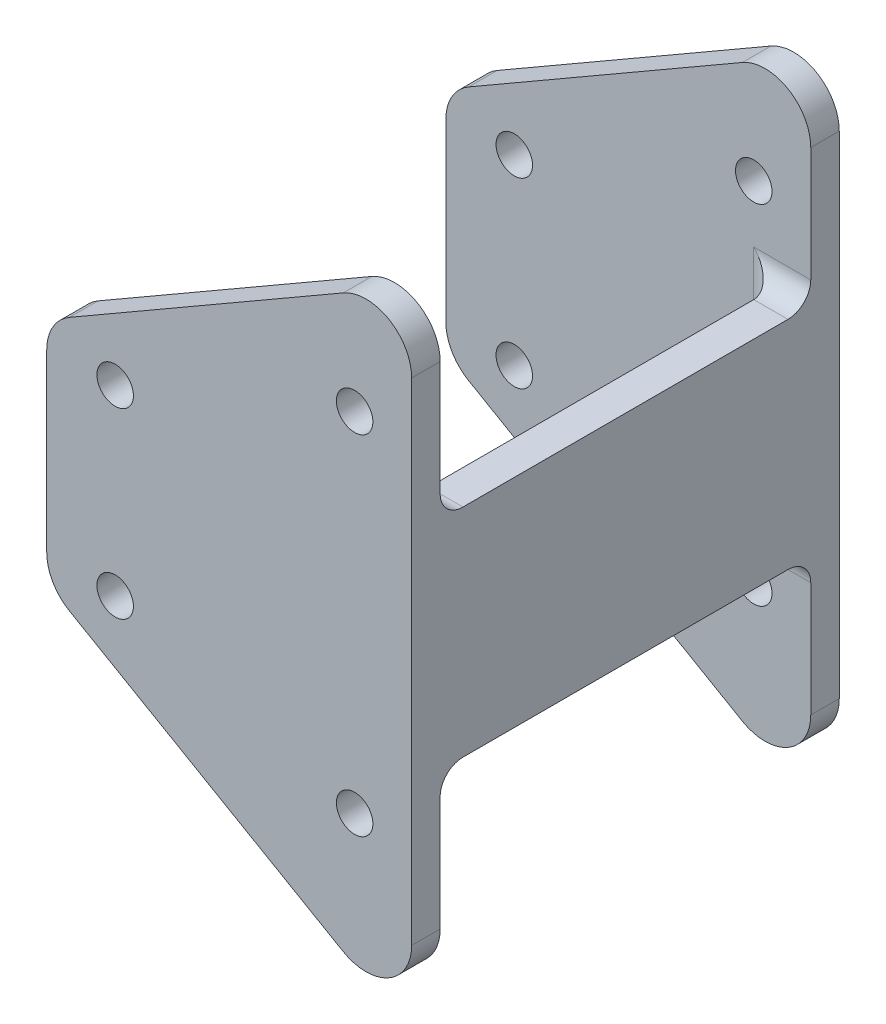
ISO-10303-21;
HEADER;
FILE_DESCRIPTION(('STEP AP214'),'2;1');
FILE_NAME('part.step','',(''),(''),'','','');
FILE_SCHEMA(('AUTOMOTIVE_DESIGN { 1 0 10303 214 1 1 1 1 }'));
ENDSEC;
DATA;
#1=APPLICATION_CONTEXT('core data for automotive mechanical design processes');
#2=APPLICATION_PROTOCOL_DEFINITION('international standard','automotive_design',2000,#1);
#3=PRODUCT_CONTEXT('',#1,'mechanical');
#4=PRODUCT('Part','Part','',(#3));
#5=PRODUCT_RELATED_PRODUCT_CATEGORY('part','',(#4));
#6=PRODUCT_DEFINITION_FORMATION('','',#4);
#7=PRODUCT_DEFINITION_CONTEXT('part definition',#1,'design');
#8=PRODUCT_DEFINITION('design','',#6,#7);
#9=PRODUCT_DEFINITION_SHAPE('','',#8);
#10=(LENGTH_UNIT() NAMED_UNIT(*) SI_UNIT(.MILLI.,.METRE.));
#11=(NAMED_UNIT(*) PLANE_ANGLE_UNIT() SI_UNIT($,.RADIAN.));
#12=(NAMED_UNIT(*) SI_UNIT($,.STERADIAN.) SOLID_ANGLE_UNIT());
#13=UNCERTAINTY_MEASURE_WITH_UNIT(LENGTH_MEASURE(1.E-05),#10,'distance_accuracy_value','');
#14=(GEOMETRIC_REPRESENTATION_CONTEXT(3) GLOBAL_UNCERTAINTY_ASSIGNED_CONTEXT((#13)) GLOBAL_UNIT_ASSIGNED_CONTEXT((#10,
#11,#12)) REPRESENTATION_CONTEXT('',''));
#15=CARTESIAN_POINT('',(0.,0.,0.));
#16=DIRECTION('',(0.,0.,1.));
#17=DIRECTION('',(1.,0.,0.));
#18=AXIS2_PLACEMENT_3D('',#15,#16,#17);
#19=CARTESIAN_POINT('',(-4.,21.5470053837927,2.5));
#20=DIRECTION('',(0.,0.,-1.));
#21=DIRECTION('',(-1.,0.,0.));
#22=AXIS2_PLACEMENT_3D('',#19,#20,#21);
#23=PLANE('',#22);
#24=CARTESIAN_POINT('',(-5.,16.5111069989304,2.5));
#25=DIRECTION('',(0.,0.,-1.));
#26=DIRECTION('',(-1.,0.,0.));
#27=AXIS2_PLACEMENT_3D('',#24,#25,#26);
#28=CIRCLE('',#27,1.6);
#29=CARTESIAN_POINT('',(-6.6,16.5111069989304,2.5));
#30=VERTEX_POINT('',#29);
#31=EDGE_CURVE('E322',#30,#30,#28,.T.);
#32=ORIENTED_EDGE('',*,*,#31,.T.);
#33=EDGE_LOOP('',(#32));
#34=FACE_BOUND('',#33,.T.);
#35=CARTESIAN_POINT('',(-5.00000000000001,-14.0111069989304,2.5));
#36=DIRECTION('',(0.,0.,-1.));
#37=DIRECTION('',(-1.,0.,0.));
#38=AXIS2_PLACEMENT_3D('',#35,#36,#37);
#39=CIRCLE('',#38,1.6);
#40=CARTESIAN_POINT('',(-6.6,-14.0111069989304,2.5));
#41=VERTEX_POINT('',#40);
#42=EDGE_CURVE('E317',#41,#41,#39,.T.);
#43=ORIENTED_EDGE('',*,*,#42,.T.);
#44=EDGE_LOOP('',(#43));
#45=FACE_BOUND('',#44,.T.);
#46=CARTESIAN_POINT('',(-26.,8.,2.5));
#47=DIRECTION('',(0.,0.,-1.));
#48=DIRECTION('',(-1.,0.,0.));
#49=AXIS2_PLACEMENT_3D('',#46,#47,#48);
#50=CIRCLE('',#49,1.6);
#51=CARTESIAN_POINT('',(-27.6,8.,2.5));
#52=VERTEX_POINT('',#51);
#53=EDGE_CURVE('E478',#52,#52,#50,.F.);
#54=ORIENTED_EDGE('',*,*,#53,.F.);
#55=EDGE_LOOP('',(#54));
#56=FACE_BOUND('',#55,.T.);
#57=CARTESIAN_POINT('',(-26.,-8.,2.5));
#58=DIRECTION('',(0.,0.,-1.));
#59=DIRECTION('',(-1.,0.,0.));
#60=AXIS2_PLACEMENT_3D('',#57,#58,#59);
#61=CIRCLE('',#60,1.6);
#62=CARTESIAN_POINT('',(-27.6,-8.,2.5));
#63=VERTEX_POINT('',#62);
#64=EDGE_CURVE('E313',#63,#63,#61,.F.);
#65=ORIENTED_EDGE('',*,*,#64,.F.);
#66=EDGE_LOOP('',(#65));
#67=FACE_BOUND('',#66,.T.);
#68=DIRECTION('',(1.,0.,0.));
#69=VECTOR('',#68,1.);
#70=CARTESIAN_POINT('',(-3.,-11.5,2.5));
#71=LINE('',#70,#69);
#72=CARTESIAN_POINT('',(0.,-11.5,2.5));
#73=VERTEX_POINT('',#72);
#74=CARTESIAN_POINT('',(-5.,-11.5,2.5));
#75=VERTEX_POINT('',#74);
#76=EDGE_CURVE('E332',#73,#75,#71,.F.);
#77=ORIENTED_EDGE('',*,*,#76,.T.);
#78=DIRECTION('',(0.,-1.,0.));
#79=VECTOR('',#78,1.);
#80=CARTESIAN_POINT('',(-5.,11.5,2.5));
#81=LINE('',#80,#79);
#82=CARTESIAN_POINT('',(-5.,11.5,2.5));
#83=VERTEX_POINT('',#82);
#84=EDGE_CURVE('E354',#75,#83,#81,.F.);
#85=ORIENTED_EDGE('',*,*,#84,.T.);
#86=DIRECTION('',(-1.,0.,0.));
#87=VECTOR('',#86,1.);
#88=CARTESIAN_POINT('',(0.,11.5,2.5));
#89=LINE('',#88,#87);
#90=CARTESIAN_POINT('',(0.,11.5,2.5));
#91=VERTEX_POINT('',#90);
#92=EDGE_CURVE('E330',#83,#91,#89,.F.);
#93=ORIENTED_EDGE('',*,*,#92,.T.);
#94=DIRECTION('',(0.,1.,0.));
#95=VECTOR('',#94,1.);
#96=CARTESIAN_POINT('',(0.,21.5470053837927,2.5));
#97=LINE('',#96,#95);
#98=CARTESIAN_POINT('',(0.,21.5470053837927,2.5));
#99=VERTEX_POINT('',#98);
#100=EDGE_CURVE('E260',#91,#99,#97,.T.);
#101=ORIENTED_EDGE('',*,*,#100,.T.);
#102=CARTESIAN_POINT('',(-4.,21.5470053837927,2.5));
#103=DIRECTION('',(0.,0.,1.));
#104=DIRECTION('',(-1.,0.,0.));
#105=AXIS2_PLACEMENT_3D('',#102,#103,#104);
#106=CIRCLE('',#105,4.00000000000001);
#107=CARTESIAN_POINT('',(-6.00000000000002,25.0111069989304,2.5));
#108=VERTEX_POINT('',#107);
#109=EDGE_CURVE('E244',#99,#108,#106,.T.);
#110=ORIENTED_EDGE('',*,*,#109,.T.);
#111=DIRECTION('',(-0.866025403784436,-0.500000000000004,0.));
#112=VECTOR('',#111,1.);
#113=CARTESIAN_POINT('',(-30.,11.1547005383793,2.5));
#114=LINE('',#113,#112);
#115=CARTESIAN_POINT('',(-30.,11.1547005383793,2.5));
#116=VERTEX_POINT('',#115);
#117=EDGE_CURVE('E247',#108,#116,#114,.T.);
#118=ORIENTED_EDGE('',*,*,#117,.T.);
#119=CARTESIAN_POINT('',(-28.,7.69059892324151,2.5));
#120=DIRECTION('',(0.,0.,1.));
#121=DIRECTION('',(-1.,0.,0.));
#122=AXIS2_PLACEMENT_3D('',#119,#120,#121);
#123=CIRCLE('',#122,4.);
#124=CARTESIAN_POINT('',(-32.,7.69059892324151,2.5));
#125=VERTEX_POINT('',#124);
#126=EDGE_CURVE('E250',#116,#125,#123,.T.);
#127=ORIENTED_EDGE('',*,*,#126,.T.);
#128=DIRECTION('',(0.,-1.,0.));
#129=VECTOR('',#128,1.);
#130=CARTESIAN_POINT('',(-32.,-7.6905989232415,2.5));
#131=LINE('',#130,#129);
#132=CARTESIAN_POINT('',(-32.,-7.6905989232415,2.5));
#133=VERTEX_POINT('',#132);
#134=EDGE_CURVE('E252',#125,#133,#131,.T.);
#135=ORIENTED_EDGE('',*,*,#134,.T.);
#136=CARTESIAN_POINT('',(-28.,-7.69059892324151,2.5));
#137=DIRECTION('',(0.,0.,1.));
#138=DIRECTION('',(1.,0.,0.));
#139=AXIS2_PLACEMENT_3D('',#136,#137,#138);
#140=CIRCLE('',#139,4.);
#141=CARTESIAN_POINT('',(-30.,-11.1547005383793,2.5));
#142=VERTEX_POINT('',#141);
#143=EDGE_CURVE('E254',#133,#142,#140,.T.);
#144=ORIENTED_EDGE('',*,*,#143,.T.);
#145=DIRECTION('',(0.866025403784436,-0.500000000000004,0.));
#146=VECTOR('',#145,1.);
#147=CARTESIAN_POINT('',(-6.00000000000002,-25.0111069989304,2.5));
#148=LINE('',#147,#146);
#149=CARTESIAN_POINT('',(-6.00000000000002,-25.0111069989304,2.5));
#150=VERTEX_POINT('',#149);
#151=EDGE_CURVE('E256',#142,#150,#148,.T.);
#152=ORIENTED_EDGE('',*,*,#151,.T.);
#153=CARTESIAN_POINT('',(-4.,-21.5470053837927,2.5));
#154=DIRECTION('',(0.,0.,1.));
#155=DIRECTION('',(-1.,0.,0.));
#156=AXIS2_PLACEMENT_3D('',#153,#154,#155);
#157=CIRCLE('',#156,4.00000000000001);
#158=CARTESIAN_POINT('',(0.,-21.5470053837927,2.5));
#159=VERTEX_POINT('',#158);
#160=EDGE_CURVE('E258',#150,#159,#157,.T.);
#161=ORIENTED_EDGE('',*,*,#160,.T.);
#162=EDGE_CURVE('E261',#159,#73,#97,.T.);
#163=ORIENTED_EDGE('',*,*,#162,.T.);
#164=EDGE_LOOP('',(#77,#85,#93,#101,#110,#118,#127,#135,#144,#152,#161,#163));
#165=FACE_BOUND('',#164,.T.);
#166=ADVANCED_FACE('F39',(#34,#45,#56,#67,#165),#23,.F.);
#167=CARTESIAN_POINT('',(-4.,21.5470053837927,2.5));
#168=DIRECTION('',(0.,0.,-1.));
#169=DIRECTION('',(-1.,0.,0.));
#170=AXIS2_PLACEMENT_3D('',#167,#168,#169);
#171=CYLINDRICAL_SURFACE('',#170,4.00000000000001);
#172=CARTESIAN_POINT('',(-4.,21.5470053837927,0.));
#173=DIRECTION('',(0.,0.,1.));
#174=DIRECTION('',(-1.,0.,0.));
#175=AXIS2_PLACEMENT_3D('',#172,#173,#174);
#176=CIRCLE('',#175,4.00000000000001);
#177=CARTESIAN_POINT('',(0.,21.5470053837927,0.));
#178=VERTEX_POINT('',#177);
#179=CARTESIAN_POINT('',(-6.00000000000002,25.0111069989304,0.));
#180=VERTEX_POINT('',#179);
#181=EDGE_CURVE('E243',#178,#180,#176,.T.);
#182=ORIENTED_EDGE('',*,*,#181,.T.);
#183=DIRECTION('',(0.,0.,-1.));
#184=VECTOR('',#183,1.);
#185=CARTESIAN_POINT('',(-6.00000000000002,25.0111069989304,2.5));
#186=LINE('',#185,#184);
#187=EDGE_CURVE('E300',#108,#180,#186,.T.);
#188=ORIENTED_EDGE('',*,*,#187,.F.);
#189=ORIENTED_EDGE('',*,*,#109,.F.);
#190=DIRECTION('',(0.,0.,-1.));
#191=VECTOR('',#190,1.);
#192=CARTESIAN_POINT('',(0.,21.5470053837927,2.5));
#193=LINE('',#192,#191);
#194=EDGE_CURVE('E264',#99,#178,#193,.T.);
#195=ORIENTED_EDGE('',*,*,#194,.T.);
#196=EDGE_LOOP('',(#182,#188,#189,#195));
#197=FACE_BOUND('',#196,.T.);
#198=ADVANCED_FACE('F418',(#197),#171,.T.);
#199=CARTESIAN_POINT('',(-30.,11.1547005383793,2.5));
#200=DIRECTION('',(0.500000000000004,-0.866025403784436,0.));
#201=DIRECTION('',(0.866025403784436,0.500000000000004,0.));
#202=AXIS2_PLACEMENT_3D('',#199,#200,#201);
#203=PLANE('',#202);
#204=DIRECTION('',(-0.866025403784436,-0.500000000000004,0.));
#205=VECTOR('',#204,1.);
#206=CARTESIAN_POINT('',(-30.,11.1547005383793,0.));
#207=LINE('',#206,#205);
#208=CARTESIAN_POINT('',(-30.,11.1547005383793,0.));
#209=VERTEX_POINT('',#208);
#210=EDGE_CURVE('E267',#180,#209,#207,.T.);
#211=ORIENTED_EDGE('',*,*,#210,.T.);
#212=DIRECTION('',(0.,0.,-1.));
#213=VECTOR('',#212,1.);
#214=CARTESIAN_POINT('',(-30.,11.1547005383793,2.5));
#215=LINE('',#214,#213);
#216=EDGE_CURVE('E297',#116,#209,#215,.T.);
#217=ORIENTED_EDGE('',*,*,#216,.F.);
#218=ORIENTED_EDGE('',*,*,#117,.F.);
#219=ORIENTED_EDGE('',*,*,#187,.T.);
#220=EDGE_LOOP('',(#211,#217,#218,#219));
#221=FACE_BOUND('',#220,.T.);
#222=ADVANCED_FACE('F499',(#221),#203,.F.);
#223=CARTESIAN_POINT('',(-28.,7.69059892324151,2.5));
#224=DIRECTION('',(0.,0.,-1.));
#225=DIRECTION('',(-1.,0.,0.));
#226=AXIS2_PLACEMENT_3D('',#223,#224,#225);
#227=CYLINDRICAL_SURFACE('',#226,4.);
#228=CARTESIAN_POINT('',(-28.,7.69059892324151,0.));
#229=DIRECTION('',(0.,0.,1.));
#230=DIRECTION('',(-1.,0.,0.));
#231=AXIS2_PLACEMENT_3D('',#228,#229,#230);
#232=CIRCLE('',#231,4.);
#233=CARTESIAN_POINT('',(-32.,7.69059892324151,0.));
#234=VERTEX_POINT('',#233);
#235=EDGE_CURVE('E269',#209,#234,#232,.T.);
#236=ORIENTED_EDGE('',*,*,#235,.T.);
#237=DIRECTION('',(0.,0.,-1.));
#238=VECTOR('',#237,1.);
#239=CARTESIAN_POINT('',(-32.,7.69059892324151,2.5));
#240=LINE('',#239,#238);
#241=EDGE_CURVE('E294',#125,#234,#240,.T.);
#242=ORIENTED_EDGE('',*,*,#241,.F.);
#243=ORIENTED_EDGE('',*,*,#126,.F.);
#244=ORIENTED_EDGE('',*,*,#216,.T.);
#245=EDGE_LOOP('',(#236,#242,#243,#244));
#246=FACE_BOUND('',#245,.T.);
#247=ADVANCED_FACE('F524',(#246),#227,.T.);
#248=CARTESIAN_POINT('',(-32.,-7.6905989232415,2.5));
#249=DIRECTION('',(1.,0.,0.));
#250=DIRECTION('',(0.,0.,-1.));
#251=AXIS2_PLACEMENT_3D('',#248,#249,#250);
#252=PLANE('',#251);
#253=DIRECTION('',(0.,-1.,0.));
#254=VECTOR('',#253,1.);
#255=CARTESIAN_POINT('',(-32.,-7.6905989232415,0.));
#256=LINE('',#255,#254);
#257=CARTESIAN_POINT('',(-32.,-7.6905989232415,0.));
#258=VERTEX_POINT('',#257);
#259=EDGE_CURVE('E271',#234,#258,#256,.T.);
#260=ORIENTED_EDGE('',*,*,#259,.T.);
#261=DIRECTION('',(0.,0.,-1.));
#262=VECTOR('',#261,1.);
#263=CARTESIAN_POINT('',(-32.,-7.6905989232415,2.5));
#264=LINE('',#263,#262);
#265=EDGE_CURVE('E291',#133,#258,#264,.T.);
#266=ORIENTED_EDGE('',*,*,#265,.F.);
#267=ORIENTED_EDGE('',*,*,#134,.F.);
#268=ORIENTED_EDGE('',*,*,#241,.T.);
#269=EDGE_LOOP('',(#260,#266,#267,#268));
#270=FACE_BOUND('',#269,.T.);
#271=ADVANCED_FACE('F520',(#270),#252,.F.);
#272=CARTESIAN_POINT('',(-28.,-7.69059892324151,2.5));
#273=DIRECTION('',(0.,0.,-1.));
#274=DIRECTION('',(-1.,0.,0.));
#275=AXIS2_PLACEMENT_3D('',#272,#273,#274);
#276=CYLINDRICAL_SURFACE('',#275,4.);
#277=CARTESIAN_POINT('',(-28.,-7.69059892324151,0.));
#278=DIRECTION('',(0.,0.,1.));
#279=DIRECTION('',(1.,0.,0.));
#280=AXIS2_PLACEMENT_3D('',#277,#278,#279);
#281=CIRCLE('',#280,4.);
#282=CARTESIAN_POINT('',(-30.,-11.1547005383793,0.));
#283=VERTEX_POINT('',#282);
#284=EDGE_CURVE('E273',#258,#283,#281,.T.);
#285=ORIENTED_EDGE('',*,*,#284,.T.);
#286=DIRECTION('',(0.,0.,-1.));
#287=VECTOR('',#286,1.);
#288=CARTESIAN_POINT('',(-30.,-11.1547005383793,2.5));
#289=LINE('',#288,#287);
#290=EDGE_CURVE('E288',#142,#283,#289,.T.);
#291=ORIENTED_EDGE('',*,*,#290,.F.);
#292=ORIENTED_EDGE('',*,*,#143,.F.);
#293=ORIENTED_EDGE('',*,*,#265,.T.);
#294=EDGE_LOOP('',(#285,#291,#292,#293));
#295=FACE_BOUND('',#294,.T.);
#296=ADVANCED_FACE('F516',(#295),#276,.T.);
#297=CARTESIAN_POINT('',(-6.00000000000002,-25.0111069989304,2.5));
#298=DIRECTION('',(0.500000000000004,0.866025403784437,0.));
#299=DIRECTION('',(-0.866025403784437,0.500000000000004,0.));
#300=AXIS2_PLACEMENT_3D('',#297,#298,#299);
#301=PLANE('',#300);
#302=DIRECTION('',(0.866025403784436,-0.500000000000004,0.));
#303=VECTOR('',#302,1.);
#304=CARTESIAN_POINT('',(-6.00000000000002,-25.0111069989304,0.));
#305=LINE('',#304,#303);
#306=CARTESIAN_POINT('',(-6.00000000000002,-25.0111069989304,0.));
#307=VERTEX_POINT('',#306);
#308=EDGE_CURVE('E275',#283,#307,#305,.T.);
#309=ORIENTED_EDGE('',*,*,#308,.T.);
#310=DIRECTION('',(0.,0.,-1.));
#311=VECTOR('',#310,1.);
#312=CARTESIAN_POINT('',(-6.00000000000002,-25.0111069989304,2.5));
#313=LINE('',#312,#311);
#314=EDGE_CURVE('E285',#150,#307,#313,.T.);
#315=ORIENTED_EDGE('',*,*,#314,.F.);
#316=ORIENTED_EDGE('',*,*,#151,.F.);
#317=ORIENTED_EDGE('',*,*,#290,.T.);
#318=EDGE_LOOP('',(#309,#315,#316,#317));
#319=FACE_BOUND('',#318,.T.);
#320=ADVANCED_FACE('F513',(#319),#301,.F.);
#321=CARTESIAN_POINT('',(-4.,-21.5470053837927,2.5));
#322=DIRECTION('',(0.,0.,-1.));
#323=DIRECTION('',(-1.,0.,0.));
#324=AXIS2_PLACEMENT_3D('',#321,#322,#323);
#325=CYLINDRICAL_SURFACE('',#324,4.00000000000001);
#326=CARTESIAN_POINT('',(-4.,-21.5470053837927,0.));
#327=DIRECTION('',(0.,0.,1.));
#328=DIRECTION('',(-1.,0.,0.));
#329=AXIS2_PLACEMENT_3D('',#326,#327,#328);
#330=CIRCLE('',#329,4.00000000000001);
#331=CARTESIAN_POINT('',(0.,-21.5470053837927,0.));
#332=VERTEX_POINT('',#331);
#333=EDGE_CURVE('E277',#307,#332,#330,.T.);
#334=ORIENTED_EDGE('',*,*,#333,.T.);
#335=DIRECTION('',(0.,0.,-1.));
#336=VECTOR('',#335,1.);
#337=CARTESIAN_POINT('',(0.,-21.5470053837927,2.5));
#338=LINE('',#337,#336);
#339=EDGE_CURVE('E282',#159,#332,#338,.T.);
#340=ORIENTED_EDGE('',*,*,#339,.F.);
#341=ORIENTED_EDGE('',*,*,#160,.F.);
#342=ORIENTED_EDGE('',*,*,#314,.T.);
#343=EDGE_LOOP('',(#334,#340,#341,#342));
#344=FACE_BOUND('',#343,.T.);
#345=ADVANCED_FACE('F407',(#344),#325,.T.);
#346=CARTESIAN_POINT('',(0.,21.5470053837927,2.5));
#347=DIRECTION('',(-1.,0.,0.));
#348=DIRECTION('',(0.,0.,1.));
#349=AXIS2_PLACEMENT_3D('',#346,#347,#348);
#350=PLANE('',#349);
#351=DIRECTION('',(0.,0.,-1.));
#352=VECTOR('',#351,1.);
#353=CARTESIAN_POINT('',(0.,9.5,37.5));
#354=LINE('',#353,#352);
#355=CARTESIAN_POINT('',(0.,9.5,33.));
#356=VERTEX_POINT('',#355);
#357=CARTESIAN_POINT('',(0.,9.5,4.5));
#358=VERTEX_POINT('',#357);
#359=EDGE_CURVE('E240',#356,#358,#354,.T.);
#360=ORIENTED_EDGE('',*,*,#359,.F.);
#361=CARTESIAN_POINT('',(0.,11.5,33.));
#362=DIRECTION('',(-1.,0.,0.));
#363=DIRECTION('',(0.,0.,1.));
#364=AXIS2_PLACEMENT_3D('',#361,#362,#363);
#365=CIRCLE('',#364,2.);
#366=CARTESIAN_POINT('',(0.,11.5,35.));
#367=VERTEX_POINT('',#366);
#368=EDGE_CURVE('E346',#356,#367,#365,.T.);
#369=ORIENTED_EDGE('',*,*,#368,.T.);
#370=DIRECTION('',(0.,1.,0.));
#371=VECTOR('',#370,1.);
#372=CARTESIAN_POINT('',(0.,21.5470053837927,35.));
#373=LINE('',#372,#371);
#374=CARTESIAN_POINT('',(0.,21.5470053837927,35.));
#375=VERTEX_POINT('',#374);
#376=EDGE_CURVE('E381',#367,#375,#373,.T.);
#377=ORIENTED_EDGE('',*,*,#376,.T.);
#378=DIRECTION('',(0.,0.,-1.));
#379=VECTOR('',#378,1.);
#380=CARTESIAN_POINT('',(0.,21.5470053837927,37.5));
#381=LINE('',#380,#379);
#382=CARTESIAN_POINT('',(0.,21.5470053837927,37.5));
#383=VERTEX_POINT('',#382);
#384=EDGE_CURVE('E432',#383,#375,#381,.T.);
#385=ORIENTED_EDGE('',*,*,#384,.F.);
#386=DIRECTION('',(0.,1.,0.));
#387=VECTOR('',#386,1.);
#388=CARTESIAN_POINT('',(0.,9.5,37.5));
#389=LINE('',#388,#387);
#390=CARTESIAN_POINT('',(0.,-21.5470053837927,37.5));
#391=VERTEX_POINT('',#390);
#392=EDGE_CURVE('E216',#391,#383,#389,.T.);
#393=ORIENTED_EDGE('',*,*,#392,.F.);
#394=DIRECTION('',(0.,0.,-1.));
#395=VECTOR('',#394,1.);
#396=CARTESIAN_POINT('',(0.,-21.5470053837927,37.5));
#397=LINE('',#396,#395);
#398=CARTESIAN_POINT('',(0.,-21.5470053837927,35.));
#399=VERTEX_POINT('',#398);
#400=EDGE_CURVE('E380',#391,#399,#397,.T.);
#401=ORIENTED_EDGE('',*,*,#400,.T.);
#402=CARTESIAN_POINT('',(0.,-11.5,35.));
#403=VERTEX_POINT('',#402);
#404=EDGE_CURVE('E220',#399,#403,#373,.T.);
#405=ORIENTED_EDGE('',*,*,#404,.T.);
#406=CARTESIAN_POINT('',(0.,-11.5,33.));
#407=DIRECTION('',(-1.,0.,0.));
#408=DIRECTION('',(0.,0.,1.));
#409=AXIS2_PLACEMENT_3D('',#406,#407,#408);
#410=CIRCLE('',#409,2.);
#411=CARTESIAN_POINT('',(0.,-9.5,33.));
#412=VERTEX_POINT('',#411);
#413=EDGE_CURVE('E340',#403,#412,#410,.T.);
#414=ORIENTED_EDGE('',*,*,#413,.T.);
#415=DIRECTION('',(0.,0.,-1.));
#416=VECTOR('',#415,1.);
#417=CARTESIAN_POINT('',(0.,-9.5,37.5));
#418=LINE('',#417,#416);
#419=CARTESIAN_POINT('',(0.,-9.5,4.5));
#420=VERTEX_POINT('',#419);
#421=EDGE_CURVE('E226',#412,#420,#418,.T.);
#422=ORIENTED_EDGE('',*,*,#421,.T.);
#423=CARTESIAN_POINT('',(0.,-11.5,4.5));
#424=DIRECTION('',(-1.,0.,0.));
#425=DIRECTION('',(0.,0.,1.));
#426=AXIS2_PLACEMENT_3D('',#423,#424,#425);
#427=CIRCLE('',#426,2.);
#428=EDGE_CURVE('E342',#420,#73,#427,.T.);
#429=ORIENTED_EDGE('',*,*,#428,.T.);
#430=ORIENTED_EDGE('',*,*,#162,.F.);
#431=ORIENTED_EDGE('',*,*,#339,.T.);
#432=DIRECTION('',(0.,1.,0.));
#433=VECTOR('',#432,1.);
#434=CARTESIAN_POINT('',(0.,21.5470053837927,0.));
#435=LINE('',#434,#433);
#436=EDGE_CURVE('E248',#332,#178,#435,.T.);
#437=ORIENTED_EDGE('',*,*,#436,.T.);
#438=ORIENTED_EDGE('',*,*,#194,.F.);
#439=ORIENTED_EDGE('',*,*,#100,.F.);
#440=CARTESIAN_POINT('',(0.,11.5,4.5));
#441=DIRECTION('',(-1.,0.,0.));
#442=DIRECTION('',(0.,0.,1.));
#443=AXIS2_PLACEMENT_3D('',#440,#441,#442);
#444=CIRCLE('',#443,2.);
#445=EDGE_CURVE('E344',#91,#358,#444,.T.);
#446=ORIENTED_EDGE('',*,*,#445,.T.);
#447=EDGE_LOOP('',(#360,#369,#377,#385,#393,#401,#405,#414,#422,#429,#430,#431,#437,#438,#439,#446));
#448=FACE_BOUND('',#447,.T.);
#449=ADVANCED_FACE('F377',(#448),#350,.F.);
#450=CARTESIAN_POINT('',(-4.,21.5470053837927,0.));
#451=DIRECTION('',(0.,0.,-1.));
#452=DIRECTION('',(-1.,0.,0.));
#453=AXIS2_PLACEMENT_3D('',#450,#451,#452);
#454=PLANE('',#453);
#455=CARTESIAN_POINT('',(-5.,16.5111069989304,0.));
#456=DIRECTION('',(0.,0.,1.));
#457=DIRECTION('',(1.,0.,0.));
#458=AXIS2_PLACEMENT_3D('',#455,#456,#457);
#459=CIRCLE('',#458,1.6);
#460=CARTESIAN_POINT('',(-3.4,16.5111069989304,0.));
#461=VERTEX_POINT('',#460);
#462=EDGE_CURVE('E318',#461,#461,#459,.T.);
#463=ORIENTED_EDGE('',*,*,#462,.T.);
#464=EDGE_LOOP('',(#463));
#465=FACE_BOUND('',#464,.T.);
#466=CARTESIAN_POINT('',(-5.00000000000001,-14.0111069989304,0.));
#467=DIRECTION('',(0.,0.,1.));
#468=DIRECTION('',(1.,0.,0.));
#469=AXIS2_PLACEMENT_3D('',#466,#467,#468);
#470=CIRCLE('',#469,1.6);
#471=CARTESIAN_POINT('',(-3.40000000000001,-14.0111069989304,0.));
#472=VERTEX_POINT('',#471);
#473=EDGE_CURVE('E913',#472,#472,#470,.T.);
#474=ORIENTED_EDGE('',*,*,#473,.T.);
#475=EDGE_LOOP('',(#474));
#476=FACE_BOUND('',#475,.T.);
#477=CARTESIAN_POINT('',(-26.,8.,0.));
#478=DIRECTION('',(0.,0.,-1.));
#479=DIRECTION('',(-1.,0.,0.));
#480=AXIS2_PLACEMENT_3D('',#477,#478,#479);
#481=CIRCLE('',#480,1.6);
#482=CARTESIAN_POINT('',(-27.6,8.,0.));
#483=VERTEX_POINT('',#482);
#484=EDGE_CURVE('E312',#483,#483,#481,.F.);
#485=ORIENTED_EDGE('',*,*,#484,.T.);
#486=EDGE_LOOP('',(#485));
#487=FACE_BOUND('',#486,.T.);
#488=CARTESIAN_POINT('',(-26.,-8.,0.));
#489=DIRECTION('',(0.,0.,-1.));
#490=DIRECTION('',(-1.,0.,0.));
#491=AXIS2_PLACEMENT_3D('',#488,#489,#490);
#492=CIRCLE('',#491,1.6);
#493=CARTESIAN_POINT('',(-27.6,-8.,0.));
#494=VERTEX_POINT('',#493);
#495=EDGE_CURVE('E307',#494,#494,#492,.F.);
#496=ORIENTED_EDGE('',*,*,#495,.T.);
#497=EDGE_LOOP('',(#496));
#498=FACE_BOUND('',#497,.T.);
#499=ORIENTED_EDGE('',*,*,#181,.F.);
#500=ORIENTED_EDGE('',*,*,#436,.F.);
#501=ORIENTED_EDGE('',*,*,#333,.F.);
#502=ORIENTED_EDGE('',*,*,#308,.F.);
#503=ORIENTED_EDGE('',*,*,#284,.F.);
#504=ORIENTED_EDGE('',*,*,#259,.F.);
#505=ORIENTED_EDGE('',*,*,#235,.F.);
#506=ORIENTED_EDGE('',*,*,#210,.F.);
#507=EDGE_LOOP('',(#499,#500,#501,#502,#503,#504,#505,#506));
#508=FACE_BOUND('',#507,.T.);
#509=ADVANCED_FACE('F413',(#465,#476,#487,#498,#508),#454,.T.);
#510=CARTESIAN_POINT('',(0.,9.5,37.5));
#511=DIRECTION('',(0.,-1.,0.));
#512=DIRECTION('',(1.,0.,0.));
#513=AXIS2_PLACEMENT_3D('',#510,#511,#512);
#514=PLANE('',#513);
#515=ORIENTED_EDGE('',*,*,#359,.T.);
#516=DIRECTION('',(-1.,0.,0.));
#517=VECTOR('',#516,1.);
#518=CARTESIAN_POINT('',(-3.,9.5,4.5));
#519=LINE('',#518,#517);
#520=CARTESIAN_POINT('',(-3.,9.5,4.5));
#521=VERTEX_POINT('',#520);
#522=EDGE_CURVE('E337',#358,#521,#519,.T.);
#523=ORIENTED_EDGE('',*,*,#522,.T.);
#524=DIRECTION('',(0.,0.,-1.));
#525=VECTOR('',#524,1.);
#526=CARTESIAN_POINT('',(-3.,9.5,37.5));
#527=LINE('',#526,#525);
#528=CARTESIAN_POINT('',(-3.,9.5,33.));
#529=VERTEX_POINT('',#528);
#530=EDGE_CURVE('E237',#529,#521,#527,.T.);
#531=ORIENTED_EDGE('',*,*,#530,.F.);
#532=DIRECTION('',(1.,0.,0.));
#533=VECTOR('',#532,1.);
#534=CARTESIAN_POINT('',(0.,9.5,33.));
#535=LINE('',#534,#533);
#536=EDGE_CURVE('E334',#529,#356,#535,.T.);
#537=ORIENTED_EDGE('',*,*,#536,.T.);
#538=EDGE_LOOP('',(#515,#523,#531,#537));
#539=FACE_BOUND('',#538,.T.);
#540=ADVANCED_FACE('F426',(#539),#514,.F.);
#541=CARTESIAN_POINT('',(-3.,9.5,37.5));
#542=DIRECTION('',(1.,0.,0.));
#543=DIRECTION('',(0.,1.,0.));
#544=AXIS2_PLACEMENT_3D('',#541,#542,#543);
#545=PLANE('',#544);
#546=ORIENTED_EDGE('',*,*,#530,.T.);
#547=DIRECTION('',(0.,-1.,0.));
#548=VECTOR('',#547,1.);
#549=CARTESIAN_POINT('',(-3.,-11.5,4.5));
#550=LINE('',#549,#548);
#551=CARTESIAN_POINT('',(-3.,-9.5,4.5));
#552=VERTEX_POINT('',#551);
#553=EDGE_CURVE('E351',#521,#552,#550,.T.);
#554=ORIENTED_EDGE('',*,*,#553,.T.);
#555=DIRECTION('',(0.,0.,-1.));
#556=VECTOR('',#555,1.);
#557=CARTESIAN_POINT('',(-3.,-9.5,37.5));
#558=LINE('',#557,#556);
#559=CARTESIAN_POINT('',(-3.,-9.5,33.));
#560=VERTEX_POINT('',#559);
#561=EDGE_CURVE('E234',#560,#552,#558,.T.);
#562=ORIENTED_EDGE('',*,*,#561,.F.);
#563=DIRECTION('',(0.,1.,0.));
#564=VECTOR('',#563,1.);
#565=CARTESIAN_POINT('',(-3.,9.5,33.));
#566=LINE('',#565,#564);
#567=EDGE_CURVE('E348',#560,#529,#566,.T.);
#568=ORIENTED_EDGE('',*,*,#567,.T.);
#569=EDGE_LOOP('',(#546,#554,#562,#568));
#570=FACE_BOUND('',#569,.T.);
#571=ADVANCED_FACE('F390',(#570),#545,.F.);
#572=CARTESIAN_POINT('',(0.,-9.5,37.5));
#573=DIRECTION('',(0.,1.,0.));
#574=DIRECTION('',(0.,0.,1.));
#575=AXIS2_PLACEMENT_3D('',#572,#573,#574);
#576=PLANE('',#575);
#577=ORIENTED_EDGE('',*,*,#421,.F.);
#578=DIRECTION('',(-1.,0.,0.));
#579=VECTOR('',#578,1.);
#580=CARTESIAN_POINT('',(0.,-9.5,33.));
#581=LINE('',#580,#579);
#582=EDGE_CURVE('E325',#412,#560,#581,.T.);
#583=ORIENTED_EDGE('',*,*,#582,.T.);
#584=ORIENTED_EDGE('',*,*,#561,.T.);
#585=DIRECTION('',(1.,0.,0.));
#586=VECTOR('',#585,1.);
#587=CARTESIAN_POINT('',(0.,-9.5,4.5));
#588=LINE('',#587,#586);
#589=EDGE_CURVE('E303',#552,#420,#588,.T.);
#590=ORIENTED_EDGE('',*,*,#589,.T.);
#591=EDGE_LOOP('',(#577,#583,#584,#590));
#592=FACE_BOUND('',#591,.T.);
#593=ADVANCED_FACE('F387',(#592),#576,.F.);
#594=CARTESIAN_POINT('',(0.,0.,37.5));
#595=DIRECTION('',(0.,0.,-1.));
#596=DIRECTION('',(-1.,0.,0.));
#597=AXIS2_PLACEMENT_3D('',#594,#595,#596);
#598=PLANE('',#597);
#599=CARTESIAN_POINT('',(-5.,16.5111069989304,37.5));
#600=DIRECTION('',(0.,0.,1.));
#601=DIRECTION('',(1.,0.,0.));
#602=AXIS2_PLACEMENT_3D('',#599,#600,#601);
#603=CIRCLE('',#602,1.6);
#604=CARTESIAN_POINT('',(-3.4,16.5111069989304,37.5));
#605=VERTEX_POINT('',#604);
#606=EDGE_CURVE('E919',#605,#605,#603,.T.);
#607=ORIENTED_EDGE('',*,*,#606,.F.);
#608=EDGE_LOOP('',(#607));
#609=FACE_BOUND('',#608,.T.);
#610=CARTESIAN_POINT('',(-5.00000000000001,-14.0111069989304,37.5));
#611=DIRECTION('',(0.,0.,1.));
#612=DIRECTION('',(1.,0.,0.));
#613=AXIS2_PLACEMENT_3D('',#610,#611,#612);
#614=CIRCLE('',#613,1.6);
#615=CARTESIAN_POINT('',(-3.40000000000001,-14.0111069989304,37.5));
#616=VERTEX_POINT('',#615);
#617=EDGE_CURVE('E916',#616,#616,#614,.T.);
#618=ORIENTED_EDGE('',*,*,#617,.F.);
#619=EDGE_LOOP('',(#618));
#620=FACE_BOUND('',#619,.T.);
#621=CARTESIAN_POINT('',(-26.,8.,37.5));
#622=DIRECTION('',(0.,0.,1.));
#623=DIRECTION('',(1.,0.,0.));
#624=AXIS2_PLACEMENT_3D('',#621,#622,#623);
#625=CIRCLE('',#624,1.6);
#626=CARTESIAN_POINT('',(-24.4,8.,37.5));
#627=VERTEX_POINT('',#626);
#628=EDGE_CURVE('E308',#627,#627,#625,.T.);
#629=ORIENTED_EDGE('',*,*,#628,.F.);
#630=EDGE_LOOP('',(#629));
#631=FACE_BOUND('',#630,.T.);
#632=CARTESIAN_POINT('',(-26.,-8.,37.5));
#633=DIRECTION('',(0.,0.,1.));
#634=DIRECTION('',(1.,0.,0.));
#635=AXIS2_PLACEMENT_3D('',#632,#633,#634);
#636=CIRCLE('',#635,1.6);
#637=CARTESIAN_POINT('',(-24.4,-8.,37.5));
#638=VERTEX_POINT('',#637);
#639=EDGE_CURVE('E886',#638,#638,#636,.T.);
#640=ORIENTED_EDGE('',*,*,#639,.F.);
#641=EDGE_LOOP('',(#640));
#642=FACE_BOUND('',#641,.T.);
#643=ORIENTED_EDGE('',*,*,#392,.T.);
#644=CARTESIAN_POINT('',(-4.00000000000001,21.5470053837927,37.5));
#645=DIRECTION('',(0.,0.,1.));
#646=DIRECTION('',(-1.,0.,0.));
#647=AXIS2_PLACEMENT_3D('',#644,#645,#646);
#648=CIRCLE('',#647,4.00000000000001);
#649=CARTESIAN_POINT('',(-6.00000000000003,25.0111069989304,37.5));
#650=VERTEX_POINT('',#649);
#651=EDGE_CURVE('E211',#383,#650,#648,.T.);
#652=ORIENTED_EDGE('',*,*,#651,.T.);
#653=DIRECTION('',(-0.866025403784436,-0.500000000000004,0.));
#654=VECTOR('',#653,1.);
#655=CARTESIAN_POINT('',(-30.,11.1547005383793,37.5));
#656=LINE('',#655,#654);
#657=CARTESIAN_POINT('',(-30.,11.1547005383793,37.5));
#658=VERTEX_POINT('',#657);
#659=EDGE_CURVE('E200',#650,#658,#656,.T.);
#660=ORIENTED_EDGE('',*,*,#659,.T.);
#661=CARTESIAN_POINT('',(-28.,7.69059892324151,37.5));
#662=DIRECTION('',(0.,0.,1.));
#663=DIRECTION('',(-1.,0.,0.));
#664=AXIS2_PLACEMENT_3D('',#661,#662,#663);
#665=CIRCLE('',#664,4.);
#666=CARTESIAN_POINT('',(-32.,7.69059892324151,37.5));
#667=VERTEX_POINT('',#666);
#668=EDGE_CURVE('E210',#658,#667,#665,.T.);
#669=ORIENTED_EDGE('',*,*,#668,.T.);
#670=DIRECTION('',(0.,-1.,0.));
#671=VECTOR('',#670,1.);
#672=CARTESIAN_POINT('',(-32.,-7.6905989232415,37.5));
#673=LINE('',#672,#671);
#674=CARTESIAN_POINT('',(-32.,-7.6905989232415,37.5));
#675=VERTEX_POINT('',#674);
#676=EDGE_CURVE('E452',#667,#675,#673,.T.);
#677=ORIENTED_EDGE('',*,*,#676,.T.);
#678=CARTESIAN_POINT('',(-28.,-7.6905989232415,37.5));
#679=DIRECTION('',(0.,0.,1.));
#680=DIRECTION('',(1.,0.,0.));
#681=AXIS2_PLACEMENT_3D('',#678,#679,#680);
#682=CIRCLE('',#681,4.);
#683=CARTESIAN_POINT('',(-30.,-11.1547005383792,37.5));
#684=VERTEX_POINT('',#683);
#685=EDGE_CURVE('E474',#675,#684,#682,.T.);
#686=ORIENTED_EDGE('',*,*,#685,.T.);
#687=DIRECTION('',(0.866025403784436,-0.500000000000004,0.));
#688=VECTOR('',#687,1.);
#689=CARTESIAN_POINT('',(-6.00000000000003,-25.0111069989304,37.5));
#690=LINE('',#689,#688);
#691=CARTESIAN_POINT('',(-6.00000000000003,-25.0111069989304,37.5));
#692=VERTEX_POINT('',#691);
#693=EDGE_CURVE('E472',#684,#692,#690,.T.);
#694=ORIENTED_EDGE('',*,*,#693,.T.);
#695=CARTESIAN_POINT('',(-4.00000000000001,-21.5470053837927,37.5));
#696=DIRECTION('',(0.,0.,1.));
#697=DIRECTION('',(-1.,0.,0.));
#698=AXIS2_PLACEMENT_3D('',#695,#696,#697);
#699=CIRCLE('',#698,4.00000000000001);
#700=EDGE_CURVE('E434',#692,#391,#699,.T.);
#701=ORIENTED_EDGE('',*,*,#700,.T.);
#702=EDGE_LOOP('',(#643,#652,#660,#669,#677,#686,#694,#701));
#703=FACE_BOUND('',#702,.T.);
#704=ADVANCED_FACE('F214',(#609,#620,#631,#642,#703),#598,.F.);
#705=CARTESIAN_POINT('',(-4.00000000000001,21.5470053837927,35.));
#706=DIRECTION('',(0.,0.,-1.));
#707=DIRECTION('',(-1.,0.,0.));
#708=AXIS2_PLACEMENT_3D('',#705,#706,#707);
#709=PLANE('',#708);
#710=CARTESIAN_POINT('',(-5.,16.5111069989304,35.));
#711=DIRECTION('',(0.,0.,-1.));
#712=DIRECTION('',(-1.,0.,0.));
#713=AXIS2_PLACEMENT_3D('',#710,#711,#712);
#714=CIRCLE('',#713,1.6);
#715=CARTESIAN_POINT('',(-6.6,16.5111069989304,35.));
#716=VERTEX_POINT('',#715);
#717=EDGE_CURVE('E319',#716,#716,#714,.T.);
#718=ORIENTED_EDGE('',*,*,#717,.F.);
#719=EDGE_LOOP('',(#718));
#720=FACE_BOUND('',#719,.T.);
#721=CARTESIAN_POINT('',(-5.00000000000001,-14.0111069989304,35.));
#722=DIRECTION('',(0.,0.,-1.));
#723=DIRECTION('',(-1.,0.,0.));
#724=AXIS2_PLACEMENT_3D('',#721,#722,#723);
#725=CIRCLE('',#724,1.6);
#726=CARTESIAN_POINT('',(-6.6,-14.0111069989304,35.));
#727=VERTEX_POINT('',#726);
#728=EDGE_CURVE('E314',#727,#727,#725,.T.);
#729=ORIENTED_EDGE('',*,*,#728,.F.);
#730=EDGE_LOOP('',(#729));
#731=FACE_BOUND('',#730,.T.);
#732=CARTESIAN_POINT('',(-26.,8.,35.));
#733=DIRECTION('',(0.,0.,-1.));
#734=DIRECTION('',(-1.,0.,0.));
#735=AXIS2_PLACEMENT_3D('',#732,#733,#734);
#736=CIRCLE('',#735,1.6);
#737=CARTESIAN_POINT('',(-27.6,8.,35.));
#738=VERTEX_POINT('',#737);
#739=EDGE_CURVE('E309',#738,#738,#736,.F.);
#740=ORIENTED_EDGE('',*,*,#739,.T.);
#741=EDGE_LOOP('',(#740));
#742=FACE_BOUND('',#741,.T.);
#743=CARTESIAN_POINT('',(-26.,-8.,35.));
#744=DIRECTION('',(0.,0.,-1.));
#745=DIRECTION('',(-1.,0.,0.));
#746=AXIS2_PLACEMENT_3D('',#743,#744,#745);
#747=CIRCLE('',#746,1.6);
#748=CARTESIAN_POINT('',(-27.6,-8.,35.));
#749=VERTEX_POINT('',#748);
#750=EDGE_CURVE('E304',#749,#749,#747,.F.);
#751=ORIENTED_EDGE('',*,*,#750,.T.);
#752=EDGE_LOOP('',(#751));
#753=FACE_BOUND('',#752,.T.);
#754=DIRECTION('',(1.,0.,0.));
#755=VECTOR('',#754,1.);
#756=CARTESIAN_POINT('',(-4.,11.5,35.));
#757=LINE('',#756,#755);
#758=CARTESIAN_POINT('',(-5.,11.5,35.));
#759=VERTEX_POINT('',#758);
#760=EDGE_CURVE('E54',#367,#759,#757,.F.);
#761=ORIENTED_EDGE('',*,*,#760,.T.);
#762=DIRECTION('',(0.,1.,0.));
#763=VECTOR('',#762,1.);
#764=CARTESIAN_POINT('',(-5.00000000000001,21.5470053837927,35.));
#765=LINE('',#764,#763);
#766=CARTESIAN_POINT('',(-5.,-11.5,35.));
#767=VERTEX_POINT('',#766);
#768=EDGE_CURVE('E357',#759,#767,#765,.F.);
#769=ORIENTED_EDGE('',*,*,#768,.T.);
#770=DIRECTION('',(-1.,0.,0.));
#771=VECTOR('',#770,1.);
#772=CARTESIAN_POINT('',(-4.00000000000001,-11.5,35.));
#773=LINE('',#772,#771);
#774=EDGE_CURVE('E61',#767,#403,#773,.F.);
#775=ORIENTED_EDGE('',*,*,#774,.T.);
#776=ORIENTED_EDGE('',*,*,#404,.F.);
#777=CARTESIAN_POINT('',(-4.00000000000001,-21.5470053837927,35.));
#778=DIRECTION('',(0.,0.,1.));
#779=DIRECTION('',(-1.,0.,0.));
#780=AXIS2_PLACEMENT_3D('',#777,#778,#779);
#781=CIRCLE('',#780,4.00000000000001);
#782=CARTESIAN_POINT('',(-6.00000000000003,-25.0111069989304,35.));
#783=VERTEX_POINT('',#782);
#784=EDGE_CURVE('E427',#783,#399,#781,.T.);
#785=ORIENTED_EDGE('',*,*,#784,.F.);
#786=DIRECTION('',(0.866025403784436,-0.500000000000004,0.));
#787=VECTOR('',#786,1.);
#788=CARTESIAN_POINT('',(-6.00000000000003,-25.0111069989304,35.));
#789=LINE('',#788,#787);
#790=CARTESIAN_POINT('',(-30.,-11.1547005383792,35.));
#791=VERTEX_POINT('',#790);
#792=EDGE_CURVE('E428',#791,#783,#789,.T.);
#793=ORIENTED_EDGE('',*,*,#792,.F.);
#794=CARTESIAN_POINT('',(-28.,-7.6905989232415,35.));
#795=DIRECTION('',(0.,0.,1.));
#796=DIRECTION('',(1.,0.,0.));
#797=AXIS2_PLACEMENT_3D('',#794,#795,#796);
#798=CIRCLE('',#797,4.);
#799=CARTESIAN_POINT('',(-32.,-7.6905989232415,35.));
#800=VERTEX_POINT('',#799);
#801=EDGE_CURVE('E458',#800,#791,#798,.T.);
#802=ORIENTED_EDGE('',*,*,#801,.F.);
#803=DIRECTION('',(0.,-1.,0.));
#804=VECTOR('',#803,1.);
#805=CARTESIAN_POINT('',(-32.,-7.6905989232415,35.));
#806=LINE('',#805,#804);
#807=CARTESIAN_POINT('',(-32.,7.69059892324151,35.));
#808=VERTEX_POINT('',#807);
#809=EDGE_CURVE('E451',#808,#800,#806,.T.);
#810=ORIENTED_EDGE('',*,*,#809,.F.);
#811=CARTESIAN_POINT('',(-28.,7.69059892324151,35.));
#812=DIRECTION('',(0.,0.,1.));
#813=DIRECTION('',(-1.,0.,0.));
#814=AXIS2_PLACEMENT_3D('',#811,#812,#813);
#815=CIRCLE('',#814,4.);
#816=CARTESIAN_POINT('',(-30.,11.1547005383793,35.));
#817=VERTEX_POINT('',#816);
#818=EDGE_CURVE('E456',#817,#808,#815,.T.);
#819=ORIENTED_EDGE('',*,*,#818,.F.);
#820=DIRECTION('',(-0.866025403784436,-0.500000000000004,0.));
#821=VECTOR('',#820,1.);
#822=CARTESIAN_POINT('',(-30.,11.1547005383793,35.));
#823=LINE('',#822,#821);
#824=CARTESIAN_POINT('',(-6.00000000000003,25.0111069989304,35.));
#825=VERTEX_POINT('',#824);
#826=EDGE_CURVE('E461',#825,#817,#823,.T.);
#827=ORIENTED_EDGE('',*,*,#826,.F.);
#828=CARTESIAN_POINT('',(-4.00000000000001,21.5470053837927,35.));
#829=DIRECTION('',(0.,0.,1.));
#830=DIRECTION('',(-1.,0.,0.));
#831=AXIS2_PLACEMENT_3D('',#828,#829,#830);
#832=CIRCLE('',#831,4.00000000000001);
#833=EDGE_CURVE('E224',#375,#825,#832,.T.);
#834=ORIENTED_EDGE('',*,*,#833,.F.);
#835=ORIENTED_EDGE('',*,*,#376,.F.);
#836=EDGE_LOOP('',(#761,#769,#775,#776,#785,#793,#802,#810,#819,#827,#834,#835));
#837=FACE_BOUND('',#836,.T.);
#838=ADVANCED_FACE('F370',(#720,#731,#742,#753,#837),#709,.T.);
#839=CARTESIAN_POINT('',(-4.00000000000001,21.5470053837927,37.5));
#840=DIRECTION('',(0.,0.,-1.));
#841=DIRECTION('',(-1.,0.,0.));
#842=AXIS2_PLACEMENT_3D('',#839,#840,#841);
#843=CYLINDRICAL_SURFACE('',#842,4.00000000000001);
#844=ORIENTED_EDGE('',*,*,#833,.T.);
#845=DIRECTION('',(0.,0.,-1.));
#846=VECTOR('',#845,1.);
#847=CARTESIAN_POINT('',(-6.00000000000003,25.0111069989304,37.5));
#848=LINE('',#847,#846);
#849=EDGE_CURVE('E204',#650,#825,#848,.T.);
#850=ORIENTED_EDGE('',*,*,#849,.F.);
#851=ORIENTED_EDGE('',*,*,#651,.F.);
#852=ORIENTED_EDGE('',*,*,#384,.T.);
#853=EDGE_LOOP('',(#844,#850,#851,#852));
#854=FACE_BOUND('',#853,.T.);
#855=ADVANCED_FACE('F222',(#854),#843,.T.);
#856=CARTESIAN_POINT('',(-30.,11.1547005383793,37.5));
#857=DIRECTION('',(0.500000000000004,-0.866025403784436,0.));
#858=DIRECTION('',(0.866025403784436,0.500000000000004,0.));
#859=AXIS2_PLACEMENT_3D('',#856,#857,#858);
#860=PLANE('',#859);
#861=ORIENTED_EDGE('',*,*,#826,.T.);
#862=DIRECTION('',(0.,0.,-1.));
#863=VECTOR('',#862,1.);
#864=CARTESIAN_POINT('',(-30.,11.1547005383793,37.5));
#865=LINE('',#864,#863);
#866=EDGE_CURVE('E207',#658,#817,#865,.T.);
#867=ORIENTED_EDGE('',*,*,#866,.F.);
#868=ORIENTED_EDGE('',*,*,#659,.F.);
#869=ORIENTED_EDGE('',*,*,#849,.T.);
#870=EDGE_LOOP('',(#861,#867,#868,#869));
#871=FACE_BOUND('',#870,.T.);
#872=ADVANCED_FACE('F202',(#871),#860,.F.);
#873=CARTESIAN_POINT('',(-28.,7.69059892324151,37.5));
#874=DIRECTION('',(0.,0.,-1.));
#875=DIRECTION('',(-1.,0.,0.));
#876=AXIS2_PLACEMENT_3D('',#873,#874,#875);
#877=CYLINDRICAL_SURFACE('',#876,4.);
#878=ORIENTED_EDGE('',*,*,#818,.T.);
#879=DIRECTION('',(0.,0.,-1.));
#880=VECTOR('',#879,1.);
#881=CARTESIAN_POINT('',(-32.,7.69059892324151,37.5));
#882=LINE('',#881,#880);
#883=EDGE_CURVE('E228',#667,#808,#882,.T.);
#884=ORIENTED_EDGE('',*,*,#883,.F.);
#885=ORIENTED_EDGE('',*,*,#668,.F.);
#886=ORIENTED_EDGE('',*,*,#866,.T.);
#887=EDGE_LOOP('',(#878,#884,#885,#886));
#888=FACE_BOUND('',#887,.T.);
#889=ADVANCED_FACE('F479',(#888),#877,.T.);
#890=CARTESIAN_POINT('',(-32.,-7.6905989232415,37.5));
#891=DIRECTION('',(1.,0.,0.));
#892=DIRECTION('',(0.,0.,-1.));
#893=AXIS2_PLACEMENT_3D('',#890,#891,#892);
#894=PLANE('',#893);
#895=ORIENTED_EDGE('',*,*,#809,.T.);
#896=DIRECTION('',(0.,0.,-1.));
#897=VECTOR('',#896,1.);
#898=CARTESIAN_POINT('',(-32.,-7.6905989232415,37.5));
#899=LINE('',#898,#897);
#900=EDGE_CURVE('E442',#675,#800,#899,.T.);
#901=ORIENTED_EDGE('',*,*,#900,.F.);
#902=ORIENTED_EDGE('',*,*,#676,.F.);
#903=ORIENTED_EDGE('',*,*,#883,.T.);
#904=EDGE_LOOP('',(#895,#901,#902,#903));
#905=FACE_BOUND('',#904,.T.);
#906=ADVANCED_FACE('F449',(#905),#894,.F.);
#907=CARTESIAN_POINT('',(-28.,-7.6905989232415,37.5));
#908=DIRECTION('',(0.,0.,-1.));
#909=DIRECTION('',(-1.,0.,0.));
#910=AXIS2_PLACEMENT_3D('',#907,#908,#909);
#911=CYLINDRICAL_SURFACE('',#910,4.);
#912=ORIENTED_EDGE('',*,*,#801,.T.);
#913=DIRECTION('',(0.,0.,-1.));
#914=VECTOR('',#913,1.);
#915=CARTESIAN_POINT('',(-30.,-11.1547005383792,37.5));
#916=LINE('',#915,#914);
#917=EDGE_CURVE('E439',#684,#791,#916,.T.);
#918=ORIENTED_EDGE('',*,*,#917,.F.);
#919=ORIENTED_EDGE('',*,*,#685,.F.);
#920=ORIENTED_EDGE('',*,*,#900,.T.);
#921=EDGE_LOOP('',(#912,#918,#919,#920));
#922=FACE_BOUND('',#921,.T.);
#923=ADVANCED_FACE('F484',(#922),#911,.T.);
#924=CARTESIAN_POINT('',(-6.00000000000003,-25.0111069989304,37.5));
#925=DIRECTION('',(0.500000000000004,0.866025403784437,0.));
#926=DIRECTION('',(-0.866025403784437,0.500000000000004,0.));
#927=AXIS2_PLACEMENT_3D('',#924,#925,#926);
#928=PLANE('',#927);
#929=ORIENTED_EDGE('',*,*,#792,.T.);
#930=DIRECTION('',(0.,0.,-1.));
#931=VECTOR('',#930,1.);
#932=CARTESIAN_POINT('',(-6.00000000000003,-25.0111069989304,37.5));
#933=LINE('',#932,#931);
#934=EDGE_CURVE('E436',#692,#783,#933,.T.);
#935=ORIENTED_EDGE('',*,*,#934,.F.);
#936=ORIENTED_EDGE('',*,*,#693,.F.);
#937=ORIENTED_EDGE('',*,*,#917,.T.);
#938=EDGE_LOOP('',(#929,#935,#936,#937));
#939=FACE_BOUND('',#938,.T.);
#940=ADVANCED_FACE('F466',(#939),#928,.F.);
#941=CARTESIAN_POINT('',(-4.00000000000001,-21.5470053837927,37.5));
#942=DIRECTION('',(0.,0.,-1.));
#943=DIRECTION('',(-1.,0.,0.));
#944=AXIS2_PLACEMENT_3D('',#941,#942,#943);
#945=CYLINDRICAL_SURFACE('',#944,4.00000000000001);
#946=ORIENTED_EDGE('',*,*,#784,.T.);
#947=ORIENTED_EDGE('',*,*,#400,.F.);
#948=ORIENTED_EDGE('',*,*,#700,.F.);
#949=ORIENTED_EDGE('',*,*,#934,.T.);
#950=EDGE_LOOP('',(#946,#947,#948,#949));
#951=FACE_BOUND('',#950,.T.);
#952=ADVANCED_FACE('F471',(#951),#945,.T.);
#953=CARTESIAN_POINT('',(-26.,-8.,37.5));
#954=DIRECTION('',(0.,0.,-1.));
#955=DIRECTION('',(-1.,0.,0.));
#956=AXIS2_PLACEMENT_3D('',#953,#954,#955);
#957=CYLINDRICAL_SURFACE('',#956,1.6);
#958=ORIENTED_EDGE('',*,*,#750,.F.);
#959=EDGE_LOOP('',(#958));
#960=FACE_BOUND('',#959,.T.);
#961=ORIENTED_EDGE('',*,*,#639,.T.);
#962=EDGE_LOOP('',(#961));
#963=FACE_BOUND('',#962,.T.);
#964=ADVANCED_FACE('F712',(#960,#963),#957,.F.);
#965=CARTESIAN_POINT('',(-26.,8.,37.5));
#966=DIRECTION('',(0.,0.,-1.));
#967=DIRECTION('',(-1.,0.,0.));
#968=AXIS2_PLACEMENT_3D('',#965,#966,#967);
#969=CYLINDRICAL_SURFACE('',#968,1.6);
#970=ORIENTED_EDGE('',*,*,#739,.F.);
#971=EDGE_LOOP('',(#970));
#972=FACE_BOUND('',#971,.T.);
#973=ORIENTED_EDGE('',*,*,#628,.T.);
#974=EDGE_LOOP('',(#973));
#975=FACE_BOUND('',#974,.T.);
#976=ADVANCED_FACE('F701',(#972,#975),#969,.F.);
#977=ORIENTED_EDGE('',*,*,#495,.F.);
#978=EDGE_LOOP('',(#977));
#979=FACE_BOUND('',#978,.T.);
#980=ORIENTED_EDGE('',*,*,#64,.T.);
#981=EDGE_LOOP('',(#980));
#982=FACE_BOUND('',#981,.T.);
#983=ADVANCED_FACE('F698',(#979,#982),#957,.F.);
#984=ORIENTED_EDGE('',*,*,#484,.F.);
#985=EDGE_LOOP('',(#984));
#986=FACE_BOUND('',#985,.T.);
#987=ORIENTED_EDGE('',*,*,#53,.T.);
#988=EDGE_LOOP('',(#987));
#989=FACE_BOUND('',#988,.T.);
#990=ADVANCED_FACE('F674',(#986,#989),#969,.F.);
#991=CARTESIAN_POINT('',(-5.00000000000001,-14.0111069989304,0.));
#992=DIRECTION('',(0.,0.,1.));
#993=DIRECTION('',(1.,0.,0.));
#994=AXIS2_PLACEMENT_3D('',#991,#992,#993);
#995=CYLINDRICAL_SURFACE('',#994,1.6);
#996=ORIENTED_EDGE('',*,*,#728,.T.);
#997=EDGE_LOOP('',(#996));
#998=FACE_BOUND('',#997,.T.);
#999=ORIENTED_EDGE('',*,*,#617,.T.);
#1000=EDGE_LOOP('',(#999));
#1001=FACE_BOUND('',#1000,.T.);
#1002=ADVANCED_FACE('F656',(#998,#1001),#995,.F.);
#1003=CARTESIAN_POINT('',(-5.,16.5111069989304,0.));
#1004=DIRECTION('',(0.,0.,1.));
#1005=DIRECTION('',(1.,0.,0.));
#1006=AXIS2_PLACEMENT_3D('',#1003,#1004,#1005);
#1007=CYLINDRICAL_SURFACE('',#1006,1.6);
#1008=ORIENTED_EDGE('',*,*,#717,.T.);
#1009=EDGE_LOOP('',(#1008));
#1010=FACE_BOUND('',#1009,.T.);
#1011=ORIENTED_EDGE('',*,*,#606,.T.);
#1012=EDGE_LOOP('',(#1011));
#1013=FACE_BOUND('',#1012,.T.);
#1014=ADVANCED_FACE('F645',(#1010,#1013),#1007,.F.);
#1015=ORIENTED_EDGE('',*,*,#473,.F.);
#1016=EDGE_LOOP('',(#1015));
#1017=FACE_BOUND('',#1016,.T.);
#1018=ORIENTED_EDGE('',*,*,#42,.F.);
#1019=EDGE_LOOP('',(#1018));
#1020=FACE_BOUND('',#1019,.T.);
#1021=ADVANCED_FACE('F642',(#1017,#1020),#995,.F.);
#1022=ORIENTED_EDGE('',*,*,#462,.F.);
#1023=EDGE_LOOP('',(#1022));
#1024=FACE_BOUND('',#1023,.T.);
#1025=ORIENTED_EDGE('',*,*,#31,.F.);
#1026=EDGE_LOOP('',(#1025));
#1027=FACE_BOUND('',#1026,.T.);
#1028=ADVANCED_FACE('F534',(#1024,#1027),#1007,.F.);
#1029=CARTESIAN_POINT('',(0.,-11.5,33.));
#1030=DIRECTION('',(-1.,0.,0.));
#1031=DIRECTION('',(0.,0.,1.));
#1032=AXIS2_PLACEMENT_3D('',#1029,#1030,#1031);
#1033=CYLINDRICAL_SURFACE('',#1032,2.);
#1034=ORIENTED_EDGE('',*,*,#413,.F.);
#1035=ORIENTED_EDGE('',*,*,#774,.F.);
#1036=CARTESIAN_POINT('',(-5.,-11.5,33.));
#1037=DIRECTION('',(-0.707106781186548,0.707106781186547,0.));
#1038=DIRECTION('',(-0.707106781186547,-0.707106781186548,0.));
#1039=AXIS2_PLACEMENT_3D('',#1036,#1037,#1038);
#1040=ELLIPSE('',#1039,2.82842712474619,2.);
#1041=EDGE_CURVE('E11',#767,#560,#1040,.T.);
#1042=ORIENTED_EDGE('',*,*,#1041,.T.);
#1043=ORIENTED_EDGE('',*,*,#582,.F.);
#1044=EDGE_LOOP('',(#1034,#1035,#1042,#1043));
#1045=FACE_BOUND('',#1044,.T.);
#1046=ADVANCED_FACE('F384',(#1045),#1033,.F.);
#1047=CARTESIAN_POINT('',(0.,-11.5,4.5));
#1048=DIRECTION('',(-1.,0.,0.));
#1049=DIRECTION('',(0.,0.,1.));
#1050=AXIS2_PLACEMENT_3D('',#1047,#1048,#1049);
#1051=CYLINDRICAL_SURFACE('',#1050,2.);
#1052=ORIENTED_EDGE('',*,*,#589,.F.);
#1053=CARTESIAN_POINT('',(-5.,-11.5,4.5));
#1054=DIRECTION('',(-0.707106781186548,0.707106781186547,0.));
#1055=DIRECTION('',(-0.707106781186547,-0.707106781186548,0.));
#1056=AXIS2_PLACEMENT_3D('',#1053,#1054,#1055);
#1057=ELLIPSE('',#1056,2.82842712474619,2.);
#1058=EDGE_CURVE('E359',#552,#75,#1057,.T.);
#1059=ORIENTED_EDGE('',*,*,#1058,.T.);
#1060=ORIENTED_EDGE('',*,*,#76,.F.);
#1061=ORIENTED_EDGE('',*,*,#428,.F.);
#1062=EDGE_LOOP('',(#1052,#1059,#1060,#1061));
#1063=FACE_BOUND('',#1062,.T.);
#1064=ADVANCED_FACE('F399',(#1063),#1051,.F.);
#1065=CARTESIAN_POINT('',(0.,11.5,4.5));
#1066=DIRECTION('',(1.,0.,0.));
#1067=DIRECTION('',(0.,1.,0.));
#1068=AXIS2_PLACEMENT_3D('',#1065,#1066,#1067);
#1069=CYLINDRICAL_SURFACE('',#1068,2.);
#1070=ORIENTED_EDGE('',*,*,#445,.F.);
#1071=ORIENTED_EDGE('',*,*,#92,.F.);
#1072=CARTESIAN_POINT('',(-5.,11.5,4.5));
#1073=DIRECTION('',(0.707106781186547,0.707106781186548,0.));
#1074=DIRECTION('',(0.707106781186548,-0.707106781186547,0.));
#1075=AXIS2_PLACEMENT_3D('',#1072,#1073,#1074);
#1076=ELLIPSE('',#1075,2.82842712474619,2.);
#1077=EDGE_CURVE('E362',#83,#521,#1076,.F.);
#1078=ORIENTED_EDGE('',*,*,#1077,.T.);
#1079=ORIENTED_EDGE('',*,*,#522,.F.);
#1080=EDGE_LOOP('',(#1070,#1071,#1078,#1079));
#1081=FACE_BOUND('',#1080,.T.);
#1082=ADVANCED_FACE('F424',(#1081),#1069,.F.);
#1083=CARTESIAN_POINT('',(0.,11.5,33.));
#1084=DIRECTION('',(1.,0.,0.));
#1085=DIRECTION('',(0.,1.,0.));
#1086=AXIS2_PLACEMENT_3D('',#1083,#1084,#1085);
#1087=CYLINDRICAL_SURFACE('',#1086,2.);
#1088=ORIENTED_EDGE('',*,*,#536,.F.);
#1089=CARTESIAN_POINT('',(-5.,11.5,33.));
#1090=DIRECTION('',(0.707106781186547,0.707106781186548,0.));
#1091=DIRECTION('',(0.707106781186548,-0.707106781186547,0.));
#1092=AXIS2_PLACEMENT_3D('',#1089,#1090,#1091);
#1093=ELLIPSE('',#1092,2.82842712474619,2.);
#1094=EDGE_CURVE('E47',#529,#759,#1093,.F.);
#1095=ORIENTED_EDGE('',*,*,#1094,.T.);
#1096=ORIENTED_EDGE('',*,*,#760,.F.);
#1097=ORIENTED_EDGE('',*,*,#368,.F.);
#1098=EDGE_LOOP('',(#1088,#1095,#1096,#1097));
#1099=FACE_BOUND('',#1098,.T.);
#1100=ADVANCED_FACE('F366',(#1099),#1087,.F.);
#1101=CARTESIAN_POINT('',(-5.,9.5,4.5));
#1102=DIRECTION('',(0.,1.,0.));
#1103=DIRECTION('',(-1.,0.,0.));
#1104=AXIS2_PLACEMENT_3D('',#1101,#1102,#1103);
#1105=CYLINDRICAL_SURFACE('',#1104,2.);
#1106=ORIENTED_EDGE('',*,*,#1077,.F.);
#1107=ORIENTED_EDGE('',*,*,#84,.F.);
#1108=ORIENTED_EDGE('',*,*,#1058,.F.);
#1109=ORIENTED_EDGE('',*,*,#553,.F.);
#1110=EDGE_LOOP('',(#1106,#1107,#1108,#1109));
#1111=FACE_BOUND('',#1110,.T.);
#1112=ADVANCED_FACE('F395',(#1111),#1105,.F.);
#1113=CARTESIAN_POINT('',(-5.,9.5,33.));
#1114=DIRECTION('',(0.,1.,0.));
#1115=DIRECTION('',(-1.,0.,0.));
#1116=AXIS2_PLACEMENT_3D('',#1113,#1114,#1115);
#1117=CYLINDRICAL_SURFACE('',#1116,2.);
#1118=ORIENTED_EDGE('',*,*,#1041,.F.);
#1119=ORIENTED_EDGE('',*,*,#768,.F.);
#1120=ORIENTED_EDGE('',*,*,#1094,.F.);
#1121=ORIENTED_EDGE('',*,*,#567,.F.);
#1122=EDGE_LOOP('',(#1118,#1119,#1120,#1121));
#1123=FACE_BOUND('',#1122,.T.);
#1124=ADVANCED_FACE('F41',(#1123),#1117,.F.);
#1125=CLOSED_SHELL('',(#166,#198,#222,#247,#271,#296,#320,#345,#449,#509,#540,#571,#593,#704,
#838,#855,#872,#889,#906,#923,#940,#952,#964,#976,#983,#990,#1002,#1014,#1021,#1028,#1046,#1064,
#1082,#1100,#1112,#1124));
#1126=MANIFOLD_SOLID_BREP('B2',#1125);
#1127=ADVANCED_BREP_SHAPE_REPRESENTATION('',(#18,#1126),#14);
#1128=SHAPE_DEFINITION_REPRESENTATION(#9,#1127);
ENDSEC;
END-ISO-10303-21;
